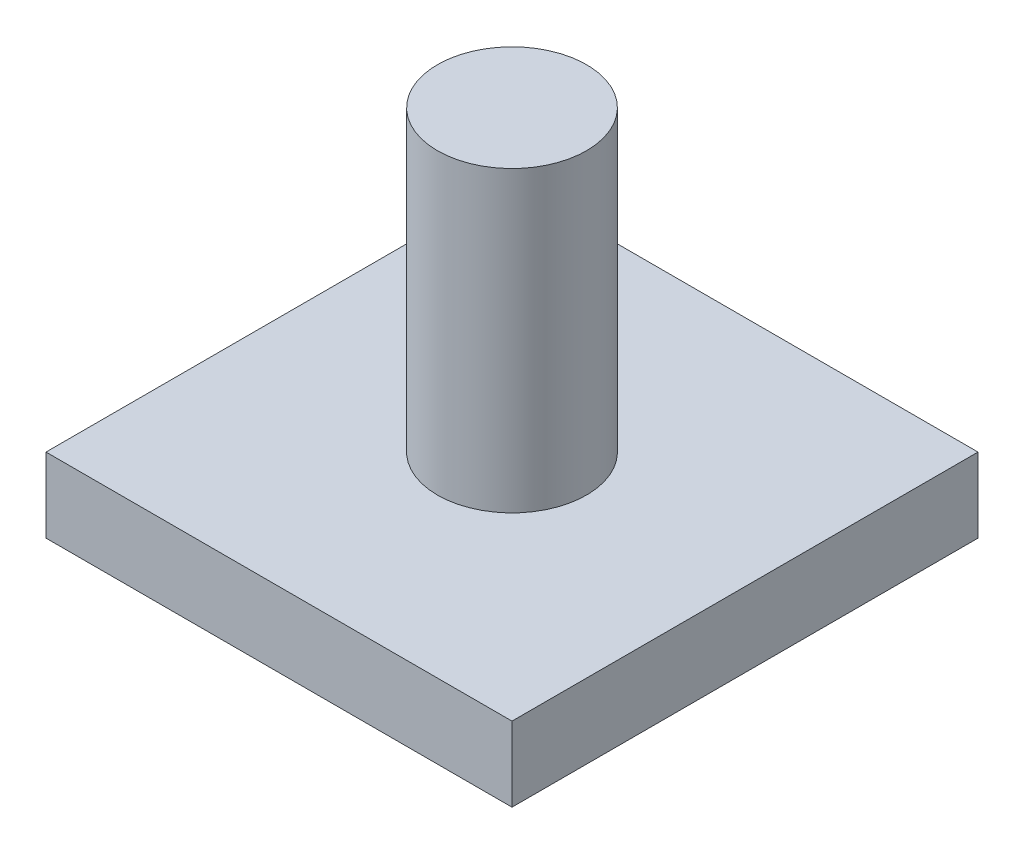
ISO-10303-21;
HEADER;
FILE_DESCRIPTION(('STEP AP214'),'2;1');
FILE_NAME('part.step','',(''),(''),'','','');
FILE_SCHEMA(('AUTOMOTIVE_DESIGN { 1 0 10303 214 1 1 1 1 }'));
ENDSEC;
DATA;
#1=APPLICATION_CONTEXT('core data for automotive mechanical design processes');
#2=APPLICATION_PROTOCOL_DEFINITION('international standard','automotive_design',2000,#1);
#3=PRODUCT_CONTEXT('',#1,'mechanical');
#4=PRODUCT('Part','Part','',(#3));
#5=PRODUCT_RELATED_PRODUCT_CATEGORY('part','',(#4));
#6=PRODUCT_DEFINITION_FORMATION('','',#4);
#7=PRODUCT_DEFINITION_CONTEXT('part definition',#1,'design');
#8=PRODUCT_DEFINITION('design','',#6,#7);
#9=PRODUCT_DEFINITION_SHAPE('','',#8);
#10=(LENGTH_UNIT() NAMED_UNIT(*) SI_UNIT(.MILLI.,.METRE.));
#11=(NAMED_UNIT(*) PLANE_ANGLE_UNIT() SI_UNIT($,.RADIAN.));
#12=(NAMED_UNIT(*) SI_UNIT($,.STERADIAN.) SOLID_ANGLE_UNIT());
#13=UNCERTAINTY_MEASURE_WITH_UNIT(LENGTH_MEASURE(1.E-05),#10,'distance_accuracy_value','');
#14=(GEOMETRIC_REPRESENTATION_CONTEXT(3) GLOBAL_UNCERTAINTY_ASSIGNED_CONTEXT((#13)) GLOBAL_UNIT_ASSIGNED_CONTEXT((#10,
#11,#12)) REPRESENTATION_CONTEXT('',''));
#15=CARTESIAN_POINT('',(0.,0.,0.));
#16=DIRECTION('',(0.,0.,1.));
#17=DIRECTION('',(1.,0.,0.));
#18=AXIS2_PLACEMENT_3D('',#15,#16,#17);
#19=CARTESIAN_POINT('',(6.25,2.,-6.25));
#20=DIRECTION('',(-1.,0.,0.));
#21=DIRECTION('',(0.,0.,1.));
#22=AXIS2_PLACEMENT_3D('',#19,#20,#21);
#23=PLANE('',#22);
#24=DIRECTION('',(0.,0.,-1.));
#25=VECTOR('',#24,1.);
#26=CARTESIAN_POINT('',(6.25,0.,-6.25));
#27=LINE('',#26,#25);
#28=CARTESIAN_POINT('',(6.25,0.,6.25));
#29=VERTEX_POINT('',#28);
#30=CARTESIAN_POINT('',(6.25,0.,-6.25));
#31=VERTEX_POINT('',#30);
#32=EDGE_CURVE('E98',#29,#31,#27,.T.);
#33=ORIENTED_EDGE('',*,*,#32,.T.);
#34=DIRECTION('',(0.,-1.,0.));
#35=VECTOR('',#34,1.);
#36=CARTESIAN_POINT('',(6.25,2.,-6.25));
#37=LINE('',#36,#35);
#38=CARTESIAN_POINT('',(6.25,2.,-6.25));
#39=VERTEX_POINT('',#38);
#40=EDGE_CURVE('E11',#39,#31,#37,.T.);
#41=ORIENTED_EDGE('',*,*,#40,.F.);
#42=DIRECTION('',(0.,0.,-1.));
#43=VECTOR('',#42,1.);
#44=CARTESIAN_POINT('',(6.25,2.,-6.25));
#45=LINE('',#44,#43);
#46=CARTESIAN_POINT('',(6.25,2.,6.25));
#47=VERTEX_POINT('',#46);
#48=EDGE_CURVE('E86',#47,#39,#45,.T.);
#49=ORIENTED_EDGE('',*,*,#48,.F.);
#50=DIRECTION('',(0.,-1.,0.));
#51=VECTOR('',#50,1.);
#52=CARTESIAN_POINT('',(6.25,2.,6.25));
#53=LINE('',#52,#51);
#54=EDGE_CURVE('E94',#47,#29,#53,.T.);
#55=ORIENTED_EDGE('',*,*,#54,.T.);
#56=EDGE_LOOP('',(#33,#41,#49,#55));
#57=FACE_BOUND('',#56,.T.);
#58=ADVANCED_FACE('F35',(#57),#23,.F.);
#59=CARTESIAN_POINT('',(-6.25,2.,-6.25));
#60=DIRECTION('',(0.,0.,1.));
#61=DIRECTION('',(1.,0.,0.));
#62=AXIS2_PLACEMENT_3D('',#59,#60,#61);
#63=PLANE('',#62);
#64=DIRECTION('',(-1.,0.,0.));
#65=VECTOR('',#64,1.);
#66=CARTESIAN_POINT('',(-6.25,0.,-6.25));
#67=LINE('',#66,#65);
#68=CARTESIAN_POINT('',(-6.25,0.,-6.25));
#69=VERTEX_POINT('',#68);
#70=EDGE_CURVE('E90',#31,#69,#67,.T.);
#71=ORIENTED_EDGE('',*,*,#70,.T.);
#72=DIRECTION('',(0.,-1.,0.));
#73=VECTOR('',#72,1.);
#74=CARTESIAN_POINT('',(-6.25,2.,-6.25));
#75=LINE('',#74,#73);
#76=CARTESIAN_POINT('',(-6.25,2.,-6.25));
#77=VERTEX_POINT('',#76);
#78=EDGE_CURVE('E43',#77,#69,#75,.T.);
#79=ORIENTED_EDGE('',*,*,#78,.F.);
#80=DIRECTION('',(-1.,0.,0.));
#81=VECTOR('',#80,1.);
#82=CARTESIAN_POINT('',(-6.25,2.,-6.25));
#83=LINE('',#82,#81);
#84=EDGE_CURVE('E81',#39,#77,#83,.T.);
#85=ORIENTED_EDGE('',*,*,#84,.F.);
#86=ORIENTED_EDGE('',*,*,#40,.T.);
#87=EDGE_LOOP('',(#71,#79,#85,#86));
#88=FACE_BOUND('',#87,.T.);
#89=ADVANCED_FACE('F89',(#88),#63,.F.);
#90=CARTESIAN_POINT('',(-6.25,2.,-6.25));
#91=DIRECTION('',(1.,0.,0.));
#92=DIRECTION('',(0.,0.,-1.));
#93=AXIS2_PLACEMENT_3D('',#90,#91,#92);
#94=PLANE('',#93);
#95=DIRECTION('',(0.,0.,1.));
#96=VECTOR('',#95,1.);
#97=CARTESIAN_POINT('',(-6.25,0.,-6.25));
#98=LINE('',#97,#96);
#99=CARTESIAN_POINT('',(-6.25,0.,6.25));
#100=VERTEX_POINT('',#99);
#101=EDGE_CURVE('E68',#69,#100,#98,.T.);
#102=ORIENTED_EDGE('',*,*,#101,.T.);
#103=DIRECTION('',(0.,-1.,0.));
#104=VECTOR('',#103,1.);
#105=CARTESIAN_POINT('',(-6.25,2.,6.25));
#106=LINE('',#105,#104);
#107=CARTESIAN_POINT('',(-6.25,2.,6.25));
#108=VERTEX_POINT('',#107);
#109=EDGE_CURVE('E91',#108,#100,#106,.T.);
#110=ORIENTED_EDGE('',*,*,#109,.F.);
#111=DIRECTION('',(0.,0.,1.));
#112=VECTOR('',#111,1.);
#113=CARTESIAN_POINT('',(-6.25,2.,-6.25));
#114=LINE('',#113,#112);
#115=EDGE_CURVE('E84',#77,#108,#114,.T.);
#116=ORIENTED_EDGE('',*,*,#115,.F.);
#117=ORIENTED_EDGE('',*,*,#78,.T.);
#118=EDGE_LOOP('',(#102,#110,#116,#117));
#119=FACE_BOUND('',#118,.T.);
#120=ADVANCED_FACE('F92',(#119),#94,.F.);
#121=CARTESIAN_POINT('',(-6.25,2.,6.25));
#122=DIRECTION('',(0.,0.,-1.));
#123=DIRECTION('',(-1.,0.,0.));
#124=AXIS2_PLACEMENT_3D('',#121,#122,#123);
#125=PLANE('',#124);
#126=DIRECTION('',(1.,0.,0.));
#127=VECTOR('',#126,1.);
#128=CARTESIAN_POINT('',(-6.25,0.,6.25));
#129=LINE('',#128,#127);
#130=EDGE_CURVE('E74',#100,#29,#129,.T.);
#131=ORIENTED_EDGE('',*,*,#130,.T.);
#132=ORIENTED_EDGE('',*,*,#54,.F.);
#133=DIRECTION('',(1.,0.,0.));
#134=VECTOR('',#133,1.);
#135=CARTESIAN_POINT('',(-6.25,2.,6.25));
#136=LINE('',#135,#134);
#137=EDGE_CURVE('E51',#108,#47,#136,.T.);
#138=ORIENTED_EDGE('',*,*,#137,.F.);
#139=ORIENTED_EDGE('',*,*,#109,.T.);
#140=EDGE_LOOP('',(#131,#132,#138,#139));
#141=FACE_BOUND('',#140,.T.);
#142=ADVANCED_FACE('F106',(#141),#125,.F.);
#143=CARTESIAN_POINT('',(0.,2.,0.));
#144=DIRECTION('',(0.,1.,0.));
#145=DIRECTION('',(0.,0.,1.));
#146=AXIS2_PLACEMENT_3D('',#143,#144,#145);
#147=PLANE('',#146);
#148=CARTESIAN_POINT('',(0.,2.,0.));
#149=DIRECTION('',(0.,1.,0.));
#150=DIRECTION('',(0.,0.,1.));
#151=AXIS2_PLACEMENT_3D('',#148,#149,#150);
#152=CIRCLE('',#151,2.);
#153=CARTESIAN_POINT('',(0.,2.,2.));
#154=VERTEX_POINT('',#153);
#155=EDGE_CURVE('E112',#154,#154,#152,.T.);
#156=ORIENTED_EDGE('',*,*,#155,.F.);
#157=EDGE_LOOP('',(#156));
#158=FACE_BOUND('',#157,.T.);
#159=ORIENTED_EDGE('',*,*,#48,.T.);
#160=ORIENTED_EDGE('',*,*,#84,.T.);
#161=ORIENTED_EDGE('',*,*,#115,.T.);
#162=ORIENTED_EDGE('',*,*,#137,.T.);
#163=EDGE_LOOP('',(#159,#160,#161,#162));
#164=FACE_BOUND('',#163,.T.);
#165=ADVANCED_FACE('F82',(#158,#164),#147,.T.);
#166=CARTESIAN_POINT('',(0.,0.,0.));
#167=DIRECTION('',(0.,1.,0.));
#168=DIRECTION('',(0.,0.,1.));
#169=AXIS2_PLACEMENT_3D('',#166,#167,#168);
#170=PLANE('',#169);
#171=ORIENTED_EDGE('',*,*,#32,.F.);
#172=ORIENTED_EDGE('',*,*,#130,.F.);
#173=ORIENTED_EDGE('',*,*,#101,.F.);
#174=ORIENTED_EDGE('',*,*,#70,.F.);
#175=EDGE_LOOP('',(#171,#172,#173,#174));
#176=FACE_BOUND('',#175,.T.);
#177=ADVANCED_FACE('F109',(#176),#170,.F.);
#178=CARTESIAN_POINT('',(0.,10.,0.));
#179=DIRECTION('',(0.,-1.,0.));
#180=DIRECTION('',(0.,0.,-1.));
#181=AXIS2_PLACEMENT_3D('',#178,#179,#180);
#182=CYLINDRICAL_SURFACE('',#181,2.);
#183=CARTESIAN_POINT('',(0.,10.,0.));
#184=DIRECTION('',(0.,1.,0.));
#185=DIRECTION('',(0.,0.,1.));
#186=AXIS2_PLACEMENT_3D('',#183,#184,#185);
#187=CIRCLE('',#186,2.);
#188=CARTESIAN_POINT('',(0.,10.,2.));
#189=VERTEX_POINT('',#188);
#190=EDGE_CURVE('E101',#189,#189,#187,.T.);
#191=ORIENTED_EDGE('',*,*,#190,.F.);
#192=EDGE_LOOP('',(#191));
#193=FACE_BOUND('',#192,.T.);
#194=ORIENTED_EDGE('',*,*,#155,.T.);
#195=EDGE_LOOP('',(#194));
#196=FACE_BOUND('',#195,.T.);
#197=ADVANCED_FACE('F120',(#193,#196),#182,.T.);
#198=CARTESIAN_POINT('',(0.,10.,0.));
#199=DIRECTION('',(0.,1.,0.));
#200=DIRECTION('',(0.,0.,1.));
#201=AXIS2_PLACEMENT_3D('',#198,#199,#200);
#202=PLANE('',#201);
#203=ORIENTED_EDGE('',*,*,#190,.T.);
#204=EDGE_LOOP('',(#203));
#205=FACE_BOUND('',#204,.T.);
#206=ADVANCED_FACE('F118',(#205),#202,.T.);
#207=CLOSED_SHELL('',(#58,#89,#120,#142,#165,#177,#197,#206));
#208=MANIFOLD_SOLID_BREP('B2',#207);
#209=ADVANCED_BREP_SHAPE_REPRESENTATION('',(#18,#208),#14);
#210=SHAPE_DEFINITION_REPRESENTATION(#9,#209);
ENDSEC;
END-ISO-10303-21;
